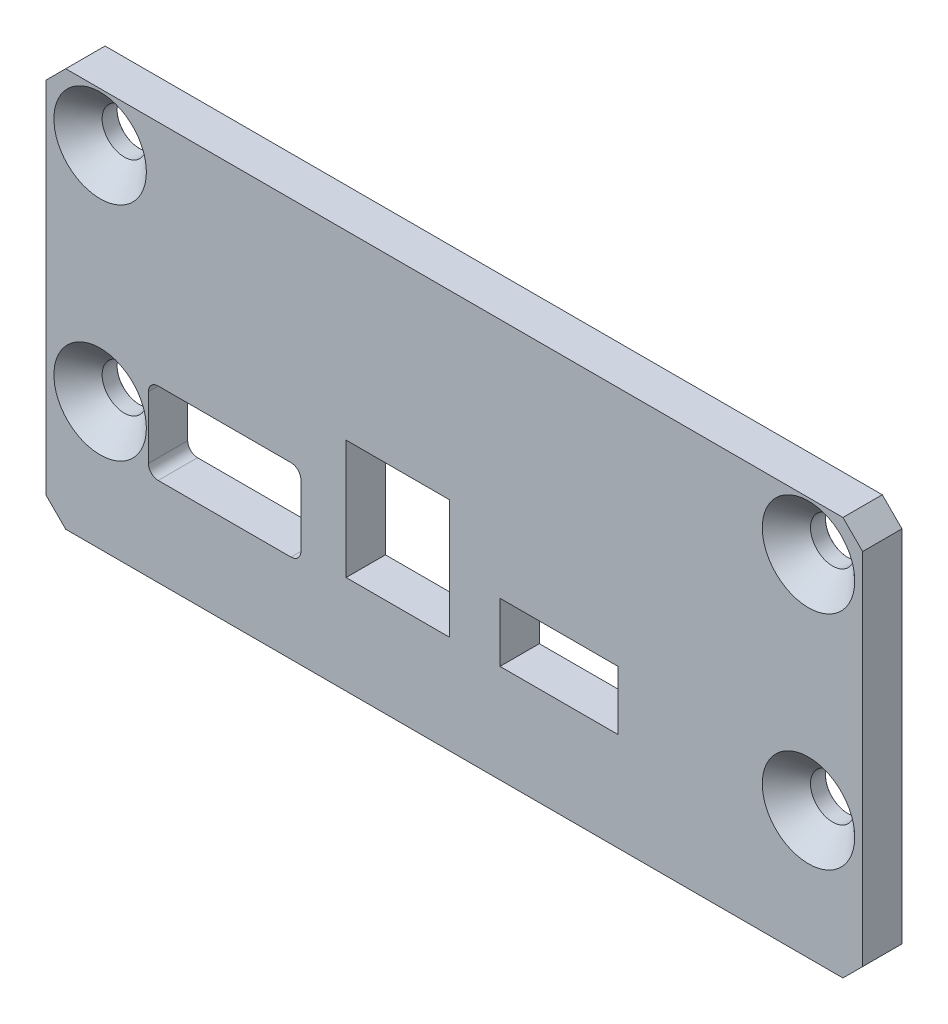
ISO-10303-21;
HEADER;
FILE_DESCRIPTION(('STEP AP214'),'2;1');
FILE_NAME('part.step','',(''),(''),'','','');
FILE_SCHEMA(('AUTOMOTIVE_DESIGN { 1 0 10303 214 1 1 1 1 }'));
ENDSEC;
DATA;
#1=APPLICATION_CONTEXT('core data for automotive mechanical design processes');
#2=APPLICATION_PROTOCOL_DEFINITION('international standard','automotive_design',2000,#1);
#3=PRODUCT_CONTEXT('',#1,'mechanical');
#4=PRODUCT('Part','Part','',(#3));
#5=PRODUCT_RELATED_PRODUCT_CATEGORY('part','',(#4));
#6=PRODUCT_DEFINITION_FORMATION('','',#4);
#7=PRODUCT_DEFINITION_CONTEXT('part definition',#1,'design');
#8=PRODUCT_DEFINITION('design','',#6,#7);
#9=PRODUCT_DEFINITION_SHAPE('','',#8);
#10=(LENGTH_UNIT() NAMED_UNIT(*) SI_UNIT(.MILLI.,.METRE.));
#11=(NAMED_UNIT(*) PLANE_ANGLE_UNIT() SI_UNIT($,.RADIAN.));
#12=(NAMED_UNIT(*) SI_UNIT($,.STERADIAN.) SOLID_ANGLE_UNIT());
#13=UNCERTAINTY_MEASURE_WITH_UNIT(LENGTH_MEASURE(1.E-05),#10,'distance_accuracy_value','');
#14=(GEOMETRIC_REPRESENTATION_CONTEXT(3) GLOBAL_UNCERTAINTY_ASSIGNED_CONTEXT((#13)) GLOBAL_UNIT_ASSIGNED_CONTEXT((#10,
#11,#12)) REPRESENTATION_CONTEXT('',''));
#15=CARTESIAN_POINT('',(0.,0.,0.));
#16=DIRECTION('',(0.,0.,1.));
#17=DIRECTION('',(1.,0.,0.));
#18=AXIS2_PLACEMENT_3D('',#15,#16,#17);
#19=CARTESIAN_POINT('',(0.,0.,4.));
#20=DIRECTION('',(0.,0.,1.));
#21=DIRECTION('',(1.,0.,0.));
#22=AXIS2_PLACEMENT_3D('',#19,#20,#21);
#23=PLANE('',#22);
#24=CARTESIAN_POINT('',(-29.5564971751413,35.54,4.));
#25=DIRECTION('',(0.,0.,1.));
#26=DIRECTION('',(1.,0.,0.));
#27=AXIS2_PLACEMENT_3D('',#24,#25,#26);
#28=CIRCLE('',#27,4.7);
#29=CARTESIAN_POINT('',(-24.8564971751413,35.54,4.));
#30=VERTEX_POINT('',#29);
#31=EDGE_CURVE('E853',#30,#30,#28,.T.);
#32=ORIENTED_EDGE('',*,*,#31,.F.);
#33=EDGE_LOOP('',(#32));
#34=FACE_BOUND('',#33,.T.);
#35=CARTESIAN_POINT('',(-29.5564971751412,13.,4.));
#36=DIRECTION('',(0.,0.,1.));
#37=DIRECTION('',(1.,0.,0.));
#38=AXIS2_PLACEMENT_3D('',#35,#36,#37);
#39=CIRCLE('',#38,4.7);
#40=CARTESIAN_POINT('',(-24.8564971751413,13.,4.));
#41=VERTEX_POINT('',#40);
#42=EDGE_CURVE('E841',#41,#41,#39,.T.);
#43=ORIENTED_EDGE('',*,*,#42,.F.);
#44=EDGE_LOOP('',(#43));
#45=FACE_BOUND('',#44,.T.);
#46=CARTESIAN_POINT('',(42.4435028248588,13.,4.));
#47=DIRECTION('',(0.,0.,1.));
#48=DIRECTION('',(1.,0.,0.));
#49=AXIS2_PLACEMENT_3D('',#46,#47,#48);
#50=CIRCLE('',#49,4.7);
#51=CARTESIAN_POINT('',(47.1435028248588,13.,4.));
#52=VERTEX_POINT('',#51);
#53=EDGE_CURVE('E829',#52,#52,#50,.T.);
#54=ORIENTED_EDGE('',*,*,#53,.F.);
#55=EDGE_LOOP('',(#54));
#56=FACE_BOUND('',#55,.T.);
#57=CARTESIAN_POINT('',(42.4435028248588,35.54,4.));
#58=DIRECTION('',(0.,0.,1.));
#59=DIRECTION('',(1.,0.,0.));
#60=AXIS2_PLACEMENT_3D('',#57,#58,#59);
#61=CIRCLE('',#60,4.7);
#62=CARTESIAN_POINT('',(47.1435028248588,35.54,4.));
#63=VERTEX_POINT('',#62);
#64=EDGE_CURVE('E817',#63,#63,#61,.T.);
#65=ORIENTED_EDGE('',*,*,#64,.F.);
#66=EDGE_LOOP('',(#65));
#67=FACE_BOUND('',#66,.T.);
#68=DIRECTION('',(-0.70710678118655,-0.707106781186545,0.));
#69=VECTOR('',#68,1.);
#70=CARTESIAN_POINT('',(-33.0564971751413,40.54,4.));
#71=LINE('',#70,#69);
#72=CARTESIAN_POINT('',(-33.0564971751413,40.54,4.));
#73=VERTEX_POINT('',#72);
#74=CARTESIAN_POINT('',(-35.0564971751413,38.54,4.));
#75=VERTEX_POINT('',#74);
#76=EDGE_CURVE('E294',#73,#75,#71,.T.);
#77=ORIENTED_EDGE('',*,*,#76,.T.);
#78=DIRECTION('',(0.,-1.,0.));
#79=VECTOR('',#78,1.);
#80=CARTESIAN_POINT('',(-35.0564971751413,38.54,4.));
#81=LINE('',#80,#79);
#82=CARTESIAN_POINT('',(-35.0564971751413,2.,4.));
#83=VERTEX_POINT('',#82);
#84=EDGE_CURVE('E297',#75,#83,#81,.T.);
#85=ORIENTED_EDGE('',*,*,#84,.T.);
#86=DIRECTION('',(0.70710678118655,-0.707106781186545,0.));
#87=VECTOR('',#86,1.);
#88=CARTESIAN_POINT('',(-35.0564971751413,2.,4.));
#89=LINE('',#88,#87);
#90=CARTESIAN_POINT('',(-33.0564971751412,0.,4.));
#91=VERTEX_POINT('',#90);
#92=EDGE_CURVE('E300',#83,#91,#89,.T.);
#93=ORIENTED_EDGE('',*,*,#92,.T.);
#94=DIRECTION('',(1.,0.,0.));
#95=VECTOR('',#94,1.);
#96=CARTESIAN_POINT('',(-33.0564971751412,0.,4.));
#97=LINE('',#96,#95);
#98=CARTESIAN_POINT('',(45.9435028248587,0.,4.));
#99=VERTEX_POINT('',#98);
#100=EDGE_CURVE('E302',#91,#99,#97,.T.);
#101=ORIENTED_EDGE('',*,*,#100,.T.);
#102=DIRECTION('',(0.70710678118655,0.707106781186545,0.));
#103=VECTOR('',#102,1.);
#104=CARTESIAN_POINT('',(45.9435028248587,0.,4.));
#105=LINE('',#104,#103);
#106=CARTESIAN_POINT('',(47.9435028248587,2.,4.));
#107=VERTEX_POINT('',#106);
#108=EDGE_CURVE('E304',#99,#107,#105,.T.);
#109=ORIENTED_EDGE('',*,*,#108,.T.);
#110=DIRECTION('',(0.,1.,0.));
#111=VECTOR('',#110,1.);
#112=CARTESIAN_POINT('',(47.9435028248587,2.,4.));
#113=LINE('',#112,#111);
#114=CARTESIAN_POINT('',(47.9435028248587,38.54,4.));
#115=VERTEX_POINT('',#114);
#116=EDGE_CURVE('E306',#107,#115,#113,.T.);
#117=ORIENTED_EDGE('',*,*,#116,.T.);
#118=DIRECTION('',(-0.70710678118655,0.707106781186545,0.));
#119=VECTOR('',#118,1.);
#120=CARTESIAN_POINT('',(47.9435028248587,38.54,4.));
#121=LINE('',#120,#119);
#122=CARTESIAN_POINT('',(45.9435028248587,40.54,4.));
#123=VERTEX_POINT('',#122);
#124=EDGE_CURVE('E308',#115,#123,#121,.T.);
#125=ORIENTED_EDGE('',*,*,#124,.T.);
#126=DIRECTION('',(-1.,0.,0.));
#127=VECTOR('',#126,1.);
#128=CARTESIAN_POINT('',(45.9435028248587,40.54,4.));
#129=LINE('',#128,#127);
#130=EDGE_CURVE('E310',#123,#73,#129,.T.);
#131=ORIENTED_EDGE('',*,*,#130,.T.);
#132=EDGE_LOOP('',(#77,#85,#93,#101,#109,#117,#125,#131));
#133=FACE_BOUND('',#132,.T.);
#134=DIRECTION('',(1.,0.,0.));
#135=VECTOR('',#134,1.);
#136=CARTESIAN_POINT('',(-24.6564971751412,9.,4.));
#137=LINE('',#136,#135);
#138=CARTESIAN_POINT('',(-23.6564971751412,9.,4.));
#139=VERTEX_POINT('',#138);
#140=CARTESIAN_POINT('',(-10.1564971751412,9.,4.));
#141=VERTEX_POINT('',#140);
#142=EDGE_CURVE('E273',#139,#141,#137,.T.);
#143=ORIENTED_EDGE('',*,*,#142,.F.);
#144=CARTESIAN_POINT('',(-23.6564971751412,10.,4.));
#145=DIRECTION('',(0.,0.,1.));
#146=DIRECTION('',(1.,0.,0.));
#147=AXIS2_PLACEMENT_3D('',#144,#145,#146);
#148=CIRCLE('',#147,1.);
#149=CARTESIAN_POINT('',(-24.6564971751412,10.,4.));
#150=VERTEX_POINT('',#149);
#151=EDGE_CURVE('E49',#139,#150,#148,.F.);
#152=ORIENTED_EDGE('',*,*,#151,.T.);
#153=DIRECTION('',(0.,-1.,0.));
#154=VECTOR('',#153,1.);
#155=CARTESIAN_POINT('',(-24.6564971751412,17.3129631137116,4.));
#156=LINE('',#155,#154);
#157=CARTESIAN_POINT('',(-24.6564971751412,16.3129631137116,4.));
#158=VERTEX_POINT('',#157);
#159=EDGE_CURVE('E271',#158,#150,#156,.T.);
#160=ORIENTED_EDGE('',*,*,#159,.F.);
#161=CARTESIAN_POINT('',(-23.6564971751412,16.3129631137116,4.));
#162=DIRECTION('',(0.,0.,1.));
#163=DIRECTION('',(1.,0.,0.));
#164=AXIS2_PLACEMENT_3D('',#161,#162,#163);
#165=CIRCLE('',#164,1.);
#166=CARTESIAN_POINT('',(-23.6564971751412,17.3129631137116,4.));
#167=VERTEX_POINT('',#166);
#168=EDGE_CURVE('E11',#158,#167,#165,.F.);
#169=ORIENTED_EDGE('',*,*,#168,.T.);
#170=DIRECTION('',(-1.,0.,0.));
#171=VECTOR('',#170,1.);
#172=CARTESIAN_POINT('',(-24.6564971751412,17.3129631137116,4.));
#173=LINE('',#172,#171);
#174=CARTESIAN_POINT('',(-10.1564971751412,17.3129631137116,4.));
#175=VERTEX_POINT('',#174);
#176=EDGE_CURVE('E280',#175,#167,#173,.T.);
#177=ORIENTED_EDGE('',*,*,#176,.F.);
#178=CARTESIAN_POINT('',(-10.1564971751412,16.3129631137116,4.));
#179=DIRECTION('',(0.,0.,1.));
#180=DIRECTION('',(1.,0.,0.));
#181=AXIS2_PLACEMENT_3D('',#178,#179,#180);
#182=CIRCLE('',#181,1.);
#183=CARTESIAN_POINT('',(-9.15649717514124,16.3129631137116,4.));
#184=VERTEX_POINT('',#183);
#185=EDGE_CURVE('E372',#175,#184,#182,.F.);
#186=ORIENTED_EDGE('',*,*,#185,.T.);
#187=DIRECTION('',(0.,1.,0.));
#188=VECTOR('',#187,1.);
#189=CARTESIAN_POINT('',(-9.15649717514124,17.3129631137116,4.));
#190=LINE('',#189,#188);
#191=CARTESIAN_POINT('',(-9.15649717514124,10.,4.));
#192=VERTEX_POINT('',#191);
#193=EDGE_CURVE('E277',#192,#184,#190,.T.);
#194=ORIENTED_EDGE('',*,*,#193,.F.);
#195=CARTESIAN_POINT('',(-10.1564971751412,10.,4.));
#196=DIRECTION('',(0.,0.,1.));
#197=DIRECTION('',(1.,0.,0.));
#198=AXIS2_PLACEMENT_3D('',#195,#196,#197);
#199=CIRCLE('',#198,1.);
#200=EDGE_CURVE('E376',#192,#141,#199,.F.);
#201=ORIENTED_EDGE('',*,*,#200,.T.);
#202=EDGE_LOOP('',(#143,#152,#160,#169,#177,#186,#194,#201));
#203=FACE_BOUND('',#202,.T.);
#204=DIRECTION('',(0.,1.,0.));
#205=VECTOR('',#204,1.);
#206=CARTESIAN_POINT('',(5.94350282485875,10.,4.));
#207=LINE('',#206,#205);
#208=CARTESIAN_POINT('',(5.94350282485875,10.,4.));
#209=VERTEX_POINT('',#208);
#210=CARTESIAN_POINT('',(5.94350282485875,22.1,4.));
#211=VERTEX_POINT('',#210);
#212=EDGE_CURVE('E242',#209,#211,#207,.T.);
#213=ORIENTED_EDGE('',*,*,#212,.F.);
#214=DIRECTION('',(1.,0.,0.));
#215=VECTOR('',#214,1.);
#216=CARTESIAN_POINT('',(-4.55649717514125,10.,4.));
#217=LINE('',#216,#215);
#218=CARTESIAN_POINT('',(-4.55649717514125,10.,4.));
#219=VERTEX_POINT('',#218);
#220=EDGE_CURVE('E240',#219,#209,#217,.T.);
#221=ORIENTED_EDGE('',*,*,#220,.F.);
#222=DIRECTION('',(0.,-1.,0.));
#223=VECTOR('',#222,1.);
#224=CARTESIAN_POINT('',(-4.55649717514125,10.,4.));
#225=LINE('',#224,#223);
#226=CARTESIAN_POINT('',(-4.55649717514125,22.1,4.));
#227=VERTEX_POINT('',#226);
#228=EDGE_CURVE('E248',#227,#219,#225,.T.);
#229=ORIENTED_EDGE('',*,*,#228,.F.);
#230=DIRECTION('',(-1.,0.,0.));
#231=VECTOR('',#230,1.);
#232=CARTESIAN_POINT('',(-4.55649717514125,22.1,4.));
#233=LINE('',#232,#231);
#234=EDGE_CURVE('E245',#211,#227,#233,.T.);
#235=ORIENTED_EDGE('',*,*,#234,.F.);
#236=EDGE_LOOP('',(#213,#221,#229,#235));
#237=FACE_BOUND('',#236,.T.);
#238=DIRECTION('',(1.,0.,0.));
#239=VECTOR('',#238,1.);
#240=CARTESIAN_POINT('',(11.0863367960814,10.,4.));
#241=LINE('',#240,#239);
#242=CARTESIAN_POINT('',(11.0863367960814,10.,4.));
#243=VERTEX_POINT('',#242);
#244=CARTESIAN_POINT('',(23.0863367960814,10.,4.));
#245=VERTEX_POINT('',#244);
#246=EDGE_CURVE('E207',#243,#245,#241,.T.);
#247=ORIENTED_EDGE('',*,*,#246,.F.);
#248=DIRECTION('',(0.,-1.,0.));
#249=VECTOR('',#248,1.);
#250=CARTESIAN_POINT('',(11.0863367960814,16.,4.));
#251=LINE('',#250,#249);
#252=CARTESIAN_POINT('',(11.0863367960814,16.,4.));
#253=VERTEX_POINT('',#252);
#254=EDGE_CURVE('E197',#253,#243,#251,.T.);
#255=ORIENTED_EDGE('',*,*,#254,.F.);
#256=DIRECTION('',(-1.,0.,0.));
#257=VECTOR('',#256,1.);
#258=CARTESIAN_POINT('',(11.0863367960814,16.,4.));
#259=LINE('',#258,#257);
#260=CARTESIAN_POINT('',(23.0863367960814,16.,4.));
#261=VERTEX_POINT('',#260);
#262=EDGE_CURVE('E222',#261,#253,#259,.T.);
#263=ORIENTED_EDGE('',*,*,#262,.F.);
#264=DIRECTION('',(0.,1.,0.));
#265=VECTOR('',#264,1.);
#266=CARTESIAN_POINT('',(23.0863367960814,16.,4.));
#267=LINE('',#266,#265);
#268=EDGE_CURVE('E220',#245,#261,#267,.T.);
#269=ORIENTED_EDGE('',*,*,#268,.F.);
#270=EDGE_LOOP('',(#247,#255,#263,#269));
#271=FACE_BOUND('',#270,.T.);
#272=ADVANCED_FACE('F34',(#34,#45,#56,#67,#133,#203,#237,#271),#23,.T.);
#273=CARTESIAN_POINT('',(0.,0.,0.));
#274=DIRECTION('',(0.,0.,1.));
#275=DIRECTION('',(1.,0.,0.));
#276=AXIS2_PLACEMENT_3D('',#273,#274,#275);
#277=PLANE('',#276);
#278=CARTESIAN_POINT('',(-29.5564971751413,35.54,0.));
#279=DIRECTION('',(0.,0.,1.));
#280=DIRECTION('',(1.,0.,0.));
#281=AXIS2_PLACEMENT_3D('',#278,#279,#280);
#282=CIRCLE('',#281,2.275);
#283=CARTESIAN_POINT('',(-27.2814971751413,35.54,0.));
#284=VERTEX_POINT('',#283);
#285=EDGE_CURVE('E856',#284,#284,#282,.T.);
#286=ORIENTED_EDGE('',*,*,#285,.T.);
#287=EDGE_LOOP('',(#286));
#288=FACE_BOUND('',#287,.T.);
#289=CARTESIAN_POINT('',(-29.5564971751412,13.,0.));
#290=DIRECTION('',(0.,0.,1.));
#291=DIRECTION('',(1.,0.,0.));
#292=AXIS2_PLACEMENT_3D('',#289,#290,#291);
#293=CIRCLE('',#292,2.275);
#294=CARTESIAN_POINT('',(-27.2814971751413,13.,0.));
#295=VERTEX_POINT('',#294);
#296=EDGE_CURVE('E844',#295,#295,#293,.T.);
#297=ORIENTED_EDGE('',*,*,#296,.T.);
#298=EDGE_LOOP('',(#297));
#299=FACE_BOUND('',#298,.T.);
#300=CARTESIAN_POINT('',(42.4435028248588,13.,0.));
#301=DIRECTION('',(0.,0.,1.));
#302=DIRECTION('',(1.,0.,0.));
#303=AXIS2_PLACEMENT_3D('',#300,#301,#302);
#304=CIRCLE('',#303,2.275);
#305=CARTESIAN_POINT('',(44.7185028248588,13.,0.));
#306=VERTEX_POINT('',#305);
#307=EDGE_CURVE('E832',#306,#306,#304,.T.);
#308=ORIENTED_EDGE('',*,*,#307,.T.);
#309=EDGE_LOOP('',(#308));
#310=FACE_BOUND('',#309,.T.);
#311=CARTESIAN_POINT('',(42.4435028248588,35.54,0.));
#312=DIRECTION('',(0.,0.,1.));
#313=DIRECTION('',(1.,0.,0.));
#314=AXIS2_PLACEMENT_3D('',#311,#312,#313);
#315=CIRCLE('',#314,2.275);
#316=CARTESIAN_POINT('',(44.7185028248588,35.54,0.));
#317=VERTEX_POINT('',#316);
#318=EDGE_CURVE('E812',#317,#317,#315,.T.);
#319=ORIENTED_EDGE('',*,*,#318,.T.);
#320=EDGE_LOOP('',(#319));
#321=FACE_BOUND('',#320,.T.);
#322=DIRECTION('',(1.,0.,0.));
#323=VECTOR('',#322,1.);
#324=CARTESIAN_POINT('',(-4.55649717514125,10.,0.));
#325=LINE('',#324,#323);
#326=CARTESIAN_POINT('',(-4.55649717514125,10.,0.));
#327=VERTEX_POINT('',#326);
#328=CARTESIAN_POINT('',(5.94350282485875,10.,0.));
#329=VERTEX_POINT('',#328);
#330=EDGE_CURVE('E215',#327,#329,#325,.T.);
#331=ORIENTED_EDGE('',*,*,#330,.T.);
#332=DIRECTION('',(0.,1.,0.));
#333=VECTOR('',#332,1.);
#334=CARTESIAN_POINT('',(5.94350282485875,10.,0.));
#335=LINE('',#334,#333);
#336=CARTESIAN_POINT('',(5.94350282485875,22.1,0.));
#337=VERTEX_POINT('',#336);
#338=EDGE_CURVE('E253',#329,#337,#335,.T.);
#339=ORIENTED_EDGE('',*,*,#338,.T.);
#340=DIRECTION('',(-1.,0.,0.));
#341=VECTOR('',#340,1.);
#342=CARTESIAN_POINT('',(-4.55649717514125,22.1,0.));
#343=LINE('',#342,#341);
#344=CARTESIAN_POINT('',(-4.55649717514125,22.1,0.));
#345=VERTEX_POINT('',#344);
#346=EDGE_CURVE('E256',#337,#345,#343,.T.);
#347=ORIENTED_EDGE('',*,*,#346,.T.);
#348=DIRECTION('',(0.,-1.,0.));
#349=VECTOR('',#348,1.);
#350=CARTESIAN_POINT('',(-4.55649717514125,10.,0.));
#351=LINE('',#350,#349);
#352=EDGE_CURVE('E243',#345,#327,#351,.T.);
#353=ORIENTED_EDGE('',*,*,#352,.T.);
#354=EDGE_LOOP('',(#331,#339,#347,#353));
#355=FACE_BOUND('',#354,.T.);
#356=DIRECTION('',(-0.70710678118655,-0.707106781186545,0.));
#357=VECTOR('',#356,1.);
#358=CARTESIAN_POINT('',(-33.0564971751413,40.54,0.));
#359=LINE('',#358,#357);
#360=CARTESIAN_POINT('',(-33.0564971751413,40.54,0.));
#361=VERTEX_POINT('',#360);
#362=CARTESIAN_POINT('',(-35.0564971751413,38.54,0.));
#363=VERTEX_POINT('',#362);
#364=EDGE_CURVE('E283',#361,#363,#359,.T.);
#365=ORIENTED_EDGE('',*,*,#364,.F.);
#366=DIRECTION('',(-1.,0.,0.));
#367=VECTOR('',#366,1.);
#368=CARTESIAN_POINT('',(45.9435028248587,40.54,0.));
#369=LINE('',#368,#367);
#370=CARTESIAN_POINT('',(45.9435028248587,40.54,0.));
#371=VERTEX_POINT('',#370);
#372=EDGE_CURVE('E298',#371,#361,#369,.T.);
#373=ORIENTED_EDGE('',*,*,#372,.F.);
#374=DIRECTION('',(-0.70710678118655,0.707106781186545,0.));
#375=VECTOR('',#374,1.);
#376=CARTESIAN_POINT('',(47.9435028248587,38.54,0.));
#377=LINE('',#376,#375);
#378=CARTESIAN_POINT('',(47.9435028248587,38.54,0.));
#379=VERTEX_POINT('',#378);
#380=EDGE_CURVE('E325',#379,#371,#377,.T.);
#381=ORIENTED_EDGE('',*,*,#380,.F.);
#382=DIRECTION('',(0.,1.,0.));
#383=VECTOR('',#382,1.);
#384=CARTESIAN_POINT('',(47.9435028248587,2.,0.));
#385=LINE('',#384,#383);
#386=CARTESIAN_POINT('',(47.9435028248587,2.,0.));
#387=VERTEX_POINT('',#386);
#388=EDGE_CURVE('E323',#387,#379,#385,.T.);
#389=ORIENTED_EDGE('',*,*,#388,.F.);
#390=DIRECTION('',(0.70710678118655,0.707106781186545,0.));
#391=VECTOR('',#390,1.);
#392=CARTESIAN_POINT('',(45.9435028248587,0.,0.));
#393=LINE('',#392,#391);
#394=CARTESIAN_POINT('',(45.9435028248587,0.,0.));
#395=VERTEX_POINT('',#394);
#396=EDGE_CURVE('E321',#395,#387,#393,.T.);
#397=ORIENTED_EDGE('',*,*,#396,.F.);
#398=DIRECTION('',(1.,0.,0.));
#399=VECTOR('',#398,1.);
#400=CARTESIAN_POINT('',(-33.0564971751412,0.,0.));
#401=LINE('',#400,#399);
#402=CARTESIAN_POINT('',(-33.0564971751412,0.,0.));
#403=VERTEX_POINT('',#402);
#404=EDGE_CURVE('E319',#403,#395,#401,.T.);
#405=ORIENTED_EDGE('',*,*,#404,.F.);
#406=DIRECTION('',(0.70710678118655,-0.707106781186545,0.));
#407=VECTOR('',#406,1.);
#408=CARTESIAN_POINT('',(-35.0564971751413,2.,0.));
#409=LINE('',#408,#407);
#410=CARTESIAN_POINT('',(-35.0564971751413,2.,0.));
#411=VERTEX_POINT('',#410);
#412=EDGE_CURVE('E317',#411,#403,#409,.T.);
#413=ORIENTED_EDGE('',*,*,#412,.F.);
#414=DIRECTION('',(0.,-1.,0.));
#415=VECTOR('',#414,1.);
#416=CARTESIAN_POINT('',(-35.0564971751413,38.54,0.));
#417=LINE('',#416,#415);
#418=EDGE_CURVE('E315',#363,#411,#417,.T.);
#419=ORIENTED_EDGE('',*,*,#418,.F.);
#420=EDGE_LOOP('',(#365,#373,#381,#389,#397,#405,#413,#419));
#421=FACE_BOUND('',#420,.T.);
#422=DIRECTION('',(-1.,0.,0.));
#423=VECTOR('',#422,1.);
#424=CARTESIAN_POINT('',(-24.6564971751412,17.3129631137116,0.));
#425=LINE('',#424,#423);
#426=CARTESIAN_POINT('',(-10.1564971751412,17.3129631137116,0.));
#427=VERTEX_POINT('',#426);
#428=CARTESIAN_POINT('',(-23.6564971751412,17.3129631137116,0.));
#429=VERTEX_POINT('',#428);
#430=EDGE_CURVE('E274',#427,#429,#425,.T.);
#431=ORIENTED_EDGE('',*,*,#430,.T.);
#432=CARTESIAN_POINT('',(-23.6564971751412,16.3129631137116,0.));
#433=DIRECTION('',(0.,0.,1.));
#434=DIRECTION('',(1.,0.,0.));
#435=AXIS2_PLACEMENT_3D('',#432,#433,#434);
#436=CIRCLE('',#435,1.);
#437=CARTESIAN_POINT('',(-24.6564971751412,16.3129631137116,0.));
#438=VERTEX_POINT('',#437);
#439=EDGE_CURVE('E42',#429,#438,#436,.T.);
#440=ORIENTED_EDGE('',*,*,#439,.T.);
#441=DIRECTION('',(0.,-1.,0.));
#442=VECTOR('',#441,1.);
#443=CARTESIAN_POINT('',(-24.6564971751412,17.3129631137116,0.));
#444=LINE('',#443,#442);
#445=CARTESIAN_POINT('',(-24.6564971751412,10.,0.));
#446=VERTEX_POINT('',#445);
#447=EDGE_CURVE('E270',#438,#446,#444,.T.);
#448=ORIENTED_EDGE('',*,*,#447,.T.);
#449=CARTESIAN_POINT('',(-23.6564971751412,10.,0.));
#450=DIRECTION('',(0.,0.,1.));
#451=DIRECTION('',(1.,0.,0.));
#452=AXIS2_PLACEMENT_3D('',#449,#450,#451);
#453=CIRCLE('',#452,1.);
#454=CARTESIAN_POINT('',(-23.6564971751412,9.,0.));
#455=VERTEX_POINT('',#454);
#456=EDGE_CURVE('E378',#446,#455,#453,.T.);
#457=ORIENTED_EDGE('',*,*,#456,.T.);
#458=DIRECTION('',(1.,0.,0.));
#459=VECTOR('',#458,1.);
#460=CARTESIAN_POINT('',(-24.6564971751412,9.,0.));
#461=LINE('',#460,#459);
#462=CARTESIAN_POINT('',(-10.1564971751412,9.,0.));
#463=VERTEX_POINT('',#462);
#464=EDGE_CURVE('E286',#455,#463,#461,.T.);
#465=ORIENTED_EDGE('',*,*,#464,.T.);
#466=CARTESIAN_POINT('',(-10.1564971751412,10.,0.));
#467=DIRECTION('',(0.,0.,1.));
#468=DIRECTION('',(1.,0.,0.));
#469=AXIS2_PLACEMENT_3D('',#466,#467,#468);
#470=CIRCLE('',#469,1.);
#471=CARTESIAN_POINT('',(-9.15649717514124,10.,0.));
#472=VERTEX_POINT('',#471);
#473=EDGE_CURVE('E374',#463,#472,#470,.T.);
#474=ORIENTED_EDGE('',*,*,#473,.T.);
#475=DIRECTION('',(0.,1.,0.));
#476=VECTOR('',#475,1.);
#477=CARTESIAN_POINT('',(-9.15649717514124,17.3129631137116,0.));
#478=LINE('',#477,#476);
#479=CARTESIAN_POINT('',(-9.15649717514124,16.3129631137116,0.));
#480=VERTEX_POINT('',#479);
#481=EDGE_CURVE('E289',#472,#480,#478,.T.);
#482=ORIENTED_EDGE('',*,*,#481,.T.);
#483=CARTESIAN_POINT('',(-10.1564971751412,16.3129631137116,0.));
#484=DIRECTION('',(0.,0.,1.));
#485=DIRECTION('',(1.,0.,0.));
#486=AXIS2_PLACEMENT_3D('',#483,#484,#485);
#487=CIRCLE('',#486,1.);
#488=EDGE_CURVE('E370',#480,#427,#487,.T.);
#489=ORIENTED_EDGE('',*,*,#488,.T.);
#490=EDGE_LOOP('',(#431,#440,#448,#457,#465,#474,#482,#489));
#491=FACE_BOUND('',#490,.T.);
#492=DIRECTION('',(0.,-1.,0.));
#493=VECTOR('',#492,1.);
#494=CARTESIAN_POINT('',(11.0863367960814,16.,0.));
#495=LINE('',#494,#493);
#496=CARTESIAN_POINT('',(11.0863367960814,16.,0.));
#497=VERTEX_POINT('',#496);
#498=CARTESIAN_POINT('',(11.0863367960814,10.,0.));
#499=VERTEX_POINT('',#498);
#500=EDGE_CURVE('E227',#497,#499,#495,.T.);
#501=ORIENTED_EDGE('',*,*,#500,.T.);
#502=DIRECTION('',(1.,0.,0.));
#503=VECTOR('',#502,1.);
#504=CARTESIAN_POINT('',(11.0863367960814,10.,0.));
#505=LINE('',#504,#503);
#506=CARTESIAN_POINT('',(23.0863367960814,10.,0.));
#507=VERTEX_POINT('',#506);
#508=EDGE_CURVE('E214',#499,#507,#505,.T.);
#509=ORIENTED_EDGE('',*,*,#508,.T.);
#510=DIRECTION('',(0.,1.,0.));
#511=VECTOR('',#510,1.);
#512=CARTESIAN_POINT('',(23.0863367960814,16.,0.));
#513=LINE('',#512,#511);
#514=CARTESIAN_POINT('',(23.0863367960814,16.,0.));
#515=VERTEX_POINT('',#514);
#516=EDGE_CURVE('E231',#507,#515,#513,.T.);
#517=ORIENTED_EDGE('',*,*,#516,.T.);
#518=DIRECTION('',(-1.,0.,0.));
#519=VECTOR('',#518,1.);
#520=CARTESIAN_POINT('',(11.0863367960814,16.,0.));
#521=LINE('',#520,#519);
#522=EDGE_CURVE('E208',#515,#497,#521,.T.);
#523=ORIENTED_EDGE('',*,*,#522,.T.);
#524=EDGE_LOOP('',(#501,#509,#517,#523));
#525=FACE_BOUND('',#524,.T.);
#526=ADVANCED_FACE('F381',(#288,#299,#310,#321,#355,#421,#491,#525),#277,.F.);
#527=CARTESIAN_POINT('',(-33.0564971751413,40.54,4.));
#528=DIRECTION('',(0.707106781186545,-0.70710678118655,0.));
#529=DIRECTION('',(0.70710678118655,0.707106781186545,0.));
#530=AXIS2_PLACEMENT_3D('',#527,#528,#529);
#531=PLANE('',#530);
#532=ORIENTED_EDGE('',*,*,#364,.T.);
#533=DIRECTION('',(0.,0.,-1.));
#534=VECTOR('',#533,1.);
#535=CARTESIAN_POINT('',(-35.0564971751413,38.54,4.));
#536=LINE('',#535,#534);
#537=EDGE_CURVE('E348',#75,#363,#536,.T.);
#538=ORIENTED_EDGE('',*,*,#537,.F.);
#539=ORIENTED_EDGE('',*,*,#76,.F.);
#540=DIRECTION('',(0.,0.,-1.));
#541=VECTOR('',#540,1.);
#542=CARTESIAN_POINT('',(-33.0564971751413,40.54,4.));
#543=LINE('',#542,#541);
#544=EDGE_CURVE('E312',#73,#361,#543,.T.);
#545=ORIENTED_EDGE('',*,*,#544,.T.);
#546=EDGE_LOOP('',(#532,#538,#539,#545));
#547=FACE_BOUND('',#546,.T.);
#548=ADVANCED_FACE('F425',(#547),#531,.F.);
#549=CARTESIAN_POINT('',(-35.0564971751413,38.54,4.));
#550=DIRECTION('',(1.,0.,0.));
#551=DIRECTION('',(0.,0.,-1.));
#552=AXIS2_PLACEMENT_3D('',#549,#550,#551);
#553=PLANE('',#552);
#554=ORIENTED_EDGE('',*,*,#418,.T.);
#555=DIRECTION('',(0.,0.,-1.));
#556=VECTOR('',#555,1.);
#557=CARTESIAN_POINT('',(-35.0564971751413,2.,4.));
#558=LINE('',#557,#556);
#559=EDGE_CURVE('E345',#83,#411,#558,.T.);
#560=ORIENTED_EDGE('',*,*,#559,.F.);
#561=ORIENTED_EDGE('',*,*,#84,.F.);
#562=ORIENTED_EDGE('',*,*,#537,.T.);
#563=EDGE_LOOP('',(#554,#560,#561,#562));
#564=FACE_BOUND('',#563,.T.);
#565=ADVANCED_FACE('F456',(#564),#553,.F.);
#566=CARTESIAN_POINT('',(-35.0564971751413,2.,4.));
#567=DIRECTION('',(0.707106781186545,0.70710678118655,0.));
#568=DIRECTION('',(-0.70710678118655,0.707106781186545,0.));
#569=AXIS2_PLACEMENT_3D('',#566,#567,#568);
#570=PLANE('',#569);
#571=ORIENTED_EDGE('',*,*,#412,.T.);
#572=DIRECTION('',(0.,0.,-1.));
#573=VECTOR('',#572,1.);
#574=CARTESIAN_POINT('',(-33.0564971751412,0.,4.));
#575=LINE('',#574,#573);
#576=EDGE_CURVE('E342',#91,#403,#575,.T.);
#577=ORIENTED_EDGE('',*,*,#576,.F.);
#578=ORIENTED_EDGE('',*,*,#92,.F.);
#579=ORIENTED_EDGE('',*,*,#559,.T.);
#580=EDGE_LOOP('',(#571,#577,#578,#579));
#581=FACE_BOUND('',#580,.T.);
#582=ADVANCED_FACE('F452',(#581),#570,.F.);
#583=CARTESIAN_POINT('',(-33.0564971751412,0.,4.));
#584=DIRECTION('',(0.,1.,0.));
#585=DIRECTION('',(0.,0.,1.));
#586=AXIS2_PLACEMENT_3D('',#583,#584,#585);
#587=PLANE('',#586);
#588=ORIENTED_EDGE('',*,*,#404,.T.);
#589=DIRECTION('',(0.,0.,-1.));
#590=VECTOR('',#589,1.);
#591=CARTESIAN_POINT('',(45.9435028248587,0.,4.));
#592=LINE('',#591,#590);
#593=EDGE_CURVE('E339',#99,#395,#592,.T.);
#594=ORIENTED_EDGE('',*,*,#593,.F.);
#595=ORIENTED_EDGE('',*,*,#100,.F.);
#596=ORIENTED_EDGE('',*,*,#576,.T.);
#597=EDGE_LOOP('',(#588,#594,#595,#596));
#598=FACE_BOUND('',#597,.T.);
#599=ADVANCED_FACE('F448',(#598),#587,.F.);
#600=CARTESIAN_POINT('',(45.9435028248587,0.,4.));
#601=DIRECTION('',(-0.707106781186545,0.70710678118655,0.));
#602=DIRECTION('',(-0.70710678118655,-0.707106781186545,0.));
#603=AXIS2_PLACEMENT_3D('',#600,#601,#602);
#604=PLANE('',#603);
#605=ORIENTED_EDGE('',*,*,#396,.T.);
#606=DIRECTION('',(0.,0.,-1.));
#607=VECTOR('',#606,1.);
#608=CARTESIAN_POINT('',(47.9435028248587,2.,4.));
#609=LINE('',#608,#607);
#610=EDGE_CURVE('E336',#107,#387,#609,.T.);
#611=ORIENTED_EDGE('',*,*,#610,.F.);
#612=ORIENTED_EDGE('',*,*,#108,.F.);
#613=ORIENTED_EDGE('',*,*,#593,.T.);
#614=EDGE_LOOP('',(#605,#611,#612,#613));
#615=FACE_BOUND('',#614,.T.);
#616=ADVANCED_FACE('F444',(#615),#604,.F.);
#617=CARTESIAN_POINT('',(47.9435028248587,2.,4.));
#618=DIRECTION('',(-1.,0.,0.));
#619=DIRECTION('',(0.,0.,1.));
#620=AXIS2_PLACEMENT_3D('',#617,#618,#619);
#621=PLANE('',#620);
#622=ORIENTED_EDGE('',*,*,#388,.T.);
#623=DIRECTION('',(0.,0.,-1.));
#624=VECTOR('',#623,1.);
#625=CARTESIAN_POINT('',(47.9435028248587,38.54,4.));
#626=LINE('',#625,#624);
#627=EDGE_CURVE('E333',#115,#379,#626,.T.);
#628=ORIENTED_EDGE('',*,*,#627,.F.);
#629=ORIENTED_EDGE('',*,*,#116,.F.);
#630=ORIENTED_EDGE('',*,*,#610,.T.);
#631=EDGE_LOOP('',(#622,#628,#629,#630));
#632=FACE_BOUND('',#631,.T.);
#633=ADVANCED_FACE('F440',(#632),#621,.F.);
#634=CARTESIAN_POINT('',(47.9435028248587,38.54,4.));
#635=DIRECTION('',(-0.707106781186545,-0.70710678118655,0.));
#636=DIRECTION('',(0.70710678118655,-0.707106781186545,0.));
#637=AXIS2_PLACEMENT_3D('',#634,#635,#636);
#638=PLANE('',#637);
#639=ORIENTED_EDGE('',*,*,#380,.T.);
#640=DIRECTION('',(0.,0.,-1.));
#641=VECTOR('',#640,1.);
#642=CARTESIAN_POINT('',(45.9435028248587,40.54,4.));
#643=LINE('',#642,#641);
#644=EDGE_CURVE('E330',#123,#371,#643,.T.);
#645=ORIENTED_EDGE('',*,*,#644,.F.);
#646=ORIENTED_EDGE('',*,*,#124,.F.);
#647=ORIENTED_EDGE('',*,*,#627,.T.);
#648=EDGE_LOOP('',(#639,#645,#646,#647));
#649=FACE_BOUND('',#648,.T.);
#650=ADVANCED_FACE('F436',(#649),#638,.F.);
#651=CARTESIAN_POINT('',(45.9435028248587,40.54,4.));
#652=DIRECTION('',(0.,-1.,0.));
#653=DIRECTION('',(0.,0.,-1.));
#654=AXIS2_PLACEMENT_3D('',#651,#652,#653);
#655=PLANE('',#654);
#656=ORIENTED_EDGE('',*,*,#372,.T.);
#657=ORIENTED_EDGE('',*,*,#544,.F.);
#658=ORIENTED_EDGE('',*,*,#130,.F.);
#659=ORIENTED_EDGE('',*,*,#644,.T.);
#660=EDGE_LOOP('',(#656,#657,#658,#659));
#661=FACE_BOUND('',#660,.T.);
#662=ADVANCED_FACE('F433',(#661),#655,.F.);
#663=CARTESIAN_POINT('',(-24.6564971751412,17.3129631137116,4.));
#664=DIRECTION('',(1.,0.,0.));
#665=DIRECTION('',(0.,0.,-1.));
#666=AXIS2_PLACEMENT_3D('',#663,#664,#665);
#667=PLANE('',#666);
#668=ORIENTED_EDGE('',*,*,#159,.T.);
#669=DIRECTION('',(0.,0.,-1.));
#670=VECTOR('',#669,1.);
#671=CARTESIAN_POINT('',(-24.6564971751412,10.,0.));
#672=LINE('',#671,#670);
#673=EDGE_CURVE('E367',#150,#446,#672,.T.);
#674=ORIENTED_EDGE('',*,*,#673,.T.);
#675=ORIENTED_EDGE('',*,*,#447,.F.);
#676=DIRECTION('',(0.,0.,-1.));
#677=VECTOR('',#676,1.);
#678=CARTESIAN_POINT('',(-24.6564971751412,16.3129631137116,4.));
#679=LINE('',#678,#677);
#680=EDGE_CURVE('E56',#438,#158,#679,.F.);
#681=ORIENTED_EDGE('',*,*,#680,.T.);
#682=EDGE_LOOP('',(#668,#674,#675,#681));
#683=FACE_BOUND('',#682,.T.);
#684=ADVANCED_FACE('F386',(#683),#667,.T.);
#685=CARTESIAN_POINT('',(-24.6564971751412,9.,4.));
#686=DIRECTION('',(0.,1.,0.));
#687=DIRECTION('',(0.,0.,1.));
#688=AXIS2_PLACEMENT_3D('',#685,#686,#687);
#689=PLANE('',#688);
#690=ORIENTED_EDGE('',*,*,#142,.T.);
#691=DIRECTION('',(0.,0.,-1.));
#692=VECTOR('',#691,1.);
#693=CARTESIAN_POINT('',(-10.1564971751412,9.,0.));
#694=LINE('',#693,#692);
#695=EDGE_CURVE('E363',#141,#463,#694,.T.);
#696=ORIENTED_EDGE('',*,*,#695,.T.);
#697=ORIENTED_EDGE('',*,*,#464,.F.);
#698=DIRECTION('',(0.,0.,-1.));
#699=VECTOR('',#698,1.);
#700=CARTESIAN_POINT('',(-23.6564971751412,9.,4.));
#701=LINE('',#700,#699);
#702=EDGE_CURVE('E361',#455,#139,#701,.F.);
#703=ORIENTED_EDGE('',*,*,#702,.T.);
#704=EDGE_LOOP('',(#690,#696,#697,#703));
#705=FACE_BOUND('',#704,.T.);
#706=ADVANCED_FACE('F408',(#705),#689,.T.);
#707=CARTESIAN_POINT('',(-9.15649717514124,17.3129631137116,4.));
#708=DIRECTION('',(-1.,0.,0.));
#709=DIRECTION('',(0.,0.,1.));
#710=AXIS2_PLACEMENT_3D('',#707,#708,#709);
#711=PLANE('',#710);
#712=ORIENTED_EDGE('',*,*,#193,.T.);
#713=DIRECTION('',(0.,0.,-1.));
#714=VECTOR('',#713,1.);
#715=CARTESIAN_POINT('',(-9.15649717514124,16.3129631137116,0.));
#716=LINE('',#715,#714);
#717=EDGE_CURVE('E353',#184,#480,#716,.T.);
#718=ORIENTED_EDGE('',*,*,#717,.T.);
#719=ORIENTED_EDGE('',*,*,#481,.F.);
#720=DIRECTION('',(0.,0.,-1.));
#721=VECTOR('',#720,1.);
#722=CARTESIAN_POINT('',(-9.15649717514124,10.,4.));
#723=LINE('',#722,#721);
#724=EDGE_CURVE('E351',#472,#192,#723,.F.);
#725=ORIENTED_EDGE('',*,*,#724,.T.);
#726=EDGE_LOOP('',(#712,#718,#719,#725));
#727=FACE_BOUND('',#726,.T.);
#728=ADVANCED_FACE('F401',(#727),#711,.T.);
#729=CARTESIAN_POINT('',(-24.6564971751412,17.3129631137116,4.));
#730=DIRECTION('',(0.,-1.,0.));
#731=DIRECTION('',(0.,0.,-1.));
#732=AXIS2_PLACEMENT_3D('',#729,#730,#731);
#733=PLANE('',#732);
#734=ORIENTED_EDGE('',*,*,#430,.F.);
#735=DIRECTION('',(0.,0.,-1.));
#736=VECTOR('',#735,1.);
#737=CARTESIAN_POINT('',(-10.1564971751412,17.3129631137116,4.));
#738=LINE('',#737,#736);
#739=EDGE_CURVE('E359',#427,#175,#738,.F.);
#740=ORIENTED_EDGE('',*,*,#739,.T.);
#741=ORIENTED_EDGE('',*,*,#176,.T.);
#742=DIRECTION('',(0.,0.,-1.));
#743=VECTOR('',#742,1.);
#744=CARTESIAN_POINT('',(-23.6564971751412,17.3129631137116,0.));
#745=LINE('',#744,#743);
#746=EDGE_CURVE('E356',#167,#429,#745,.T.);
#747=ORIENTED_EDGE('',*,*,#746,.T.);
#748=EDGE_LOOP('',(#734,#740,#741,#747));
#749=FACE_BOUND('',#748,.T.);
#750=ADVANCED_FACE('F393',(#749),#733,.T.);
#751=CARTESIAN_POINT('',(-4.55649717514125,10.,4.));
#752=DIRECTION('',(0.,1.,0.));
#753=DIRECTION('',(0.,0.,1.));
#754=AXIS2_PLACEMENT_3D('',#751,#752,#753);
#755=PLANE('',#754);
#756=ORIENTED_EDGE('',*,*,#330,.F.);
#757=DIRECTION('',(0.,0.,-1.));
#758=VECTOR('',#757,1.);
#759=CARTESIAN_POINT('',(-4.55649717514125,10.,4.));
#760=LINE('',#759,#758);
#761=EDGE_CURVE('E250',#219,#327,#760,.T.);
#762=ORIENTED_EDGE('',*,*,#761,.F.);
#763=ORIENTED_EDGE('',*,*,#220,.T.);
#764=DIRECTION('',(0.,0.,-1.));
#765=VECTOR('',#764,1.);
#766=CARTESIAN_POINT('',(5.94350282485875,10.,4.));
#767=LINE('',#766,#765);
#768=EDGE_CURVE('E267',#209,#329,#767,.T.);
#769=ORIENTED_EDGE('',*,*,#768,.T.);
#770=EDGE_LOOP('',(#756,#762,#763,#769));
#771=FACE_BOUND('',#770,.T.);
#772=ADVANCED_FACE('F543',(#771),#755,.T.);
#773=CARTESIAN_POINT('',(5.94350282485875,10.,4.));
#774=DIRECTION('',(-1.,0.,0.));
#775=DIRECTION('',(0.,0.,1.));
#776=AXIS2_PLACEMENT_3D('',#773,#774,#775);
#777=PLANE('',#776);
#778=ORIENTED_EDGE('',*,*,#338,.F.);
#779=ORIENTED_EDGE('',*,*,#768,.F.);
#780=ORIENTED_EDGE('',*,*,#212,.T.);
#781=DIRECTION('',(0.,0.,-1.));
#782=VECTOR('',#781,1.);
#783=CARTESIAN_POINT('',(5.94350282485875,22.1,4.));
#784=LINE('',#783,#782);
#785=EDGE_CURVE('E265',#211,#337,#784,.T.);
#786=ORIENTED_EDGE('',*,*,#785,.T.);
#787=EDGE_LOOP('',(#778,#779,#780,#786));
#788=FACE_BOUND('',#787,.T.);
#789=ADVANCED_FACE('F539',(#788),#777,.T.);
#790=CARTESIAN_POINT('',(-4.55649717514125,22.1,4.));
#791=DIRECTION('',(0.,-1.,0.));
#792=DIRECTION('',(0.,0.,-1.));
#793=AXIS2_PLACEMENT_3D('',#790,#791,#792);
#794=PLANE('',#793);
#795=ORIENTED_EDGE('',*,*,#346,.F.);
#796=ORIENTED_EDGE('',*,*,#785,.F.);
#797=ORIENTED_EDGE('',*,*,#234,.T.);
#798=DIRECTION('',(0.,0.,-1.));
#799=VECTOR('',#798,1.);
#800=CARTESIAN_POINT('',(-4.55649717514125,22.1,4.));
#801=LINE('',#800,#799);
#802=EDGE_CURVE('E263',#227,#345,#801,.T.);
#803=ORIENTED_EDGE('',*,*,#802,.T.);
#804=EDGE_LOOP('',(#795,#796,#797,#803));
#805=FACE_BOUND('',#804,.T.);
#806=ADVANCED_FACE('F535',(#805),#794,.T.);
#807=CARTESIAN_POINT('',(-4.55649717514125,10.,4.));
#808=DIRECTION('',(1.,0.,0.));
#809=DIRECTION('',(0.,0.,-1.));
#810=AXIS2_PLACEMENT_3D('',#807,#808,#809);
#811=PLANE('',#810);
#812=ORIENTED_EDGE('',*,*,#352,.F.);
#813=ORIENTED_EDGE('',*,*,#802,.F.);
#814=ORIENTED_EDGE('',*,*,#228,.T.);
#815=ORIENTED_EDGE('',*,*,#761,.T.);
#816=EDGE_LOOP('',(#812,#813,#814,#815));
#817=FACE_BOUND('',#816,.T.);
#818=ADVANCED_FACE('F532',(#817),#811,.T.);
#819=CARTESIAN_POINT('',(11.0863367960814,16.,4.));
#820=DIRECTION('',(1.,0.,0.));
#821=DIRECTION('',(0.,0.,-1.));
#822=AXIS2_PLACEMENT_3D('',#819,#820,#821);
#823=PLANE('',#822);
#824=ORIENTED_EDGE('',*,*,#500,.F.);
#825=DIRECTION('',(0.,0.,-1.));
#826=VECTOR('',#825,1.);
#827=CARTESIAN_POINT('',(11.0863367960814,16.,4.));
#828=LINE('',#827,#826);
#829=EDGE_CURVE('E203',#253,#497,#828,.T.);
#830=ORIENTED_EDGE('',*,*,#829,.F.);
#831=ORIENTED_EDGE('',*,*,#254,.T.);
#832=DIRECTION('',(0.,0.,-1.));
#833=VECTOR('',#832,1.);
#834=CARTESIAN_POINT('',(11.0863367960814,10.,4.));
#835=LINE('',#834,#833);
#836=EDGE_CURVE('E200',#243,#499,#835,.T.);
#837=ORIENTED_EDGE('',*,*,#836,.T.);
#838=EDGE_LOOP('',(#824,#830,#831,#837));
#839=FACE_BOUND('',#838,.T.);
#840=ADVANCED_FACE('F199',(#839),#823,.T.);
#841=CARTESIAN_POINT('',(11.0863367960814,10.,4.));
#842=DIRECTION('',(0.,1.,0.));
#843=DIRECTION('',(0.,0.,1.));
#844=AXIS2_PLACEMENT_3D('',#841,#842,#843);
#845=PLANE('',#844);
#846=ORIENTED_EDGE('',*,*,#508,.F.);
#847=ORIENTED_EDGE('',*,*,#836,.F.);
#848=ORIENTED_EDGE('',*,*,#246,.T.);
#849=DIRECTION('',(0.,0.,-1.));
#850=VECTOR('',#849,1.);
#851=CARTESIAN_POINT('',(23.0863367960814,10.,4.));
#852=LINE('',#851,#850);
#853=EDGE_CURVE('E216',#245,#507,#852,.T.);
#854=ORIENTED_EDGE('',*,*,#853,.T.);
#855=EDGE_LOOP('',(#846,#847,#848,#854));
#856=FACE_BOUND('',#855,.T.);
#857=ADVANCED_FACE('F211',(#856),#845,.T.);
#858=CARTESIAN_POINT('',(23.0863367960814,16.,4.));
#859=DIRECTION('',(-1.,0.,0.));
#860=DIRECTION('',(0.,0.,1.));
#861=AXIS2_PLACEMENT_3D('',#858,#859,#860);
#862=PLANE('',#861);
#863=ORIENTED_EDGE('',*,*,#516,.F.);
#864=ORIENTED_EDGE('',*,*,#853,.F.);
#865=ORIENTED_EDGE('',*,*,#268,.T.);
#866=DIRECTION('',(0.,0.,-1.));
#867=VECTOR('',#866,1.);
#868=CARTESIAN_POINT('',(23.0863367960814,16.,4.));
#869=LINE('',#868,#867);
#870=EDGE_CURVE('E237',#261,#515,#869,.T.);
#871=ORIENTED_EDGE('',*,*,#870,.T.);
#872=EDGE_LOOP('',(#863,#864,#865,#871));
#873=FACE_BOUND('',#872,.T.);
#874=ADVANCED_FACE('F523',(#873),#862,.T.);
#875=CARTESIAN_POINT('',(11.0863367960814,16.,4.));
#876=DIRECTION('',(0.,-1.,0.));
#877=DIRECTION('',(0.,0.,-1.));
#878=AXIS2_PLACEMENT_3D('',#875,#876,#877);
#879=PLANE('',#878);
#880=ORIENTED_EDGE('',*,*,#522,.F.);
#881=ORIENTED_EDGE('',*,*,#870,.F.);
#882=ORIENTED_EDGE('',*,*,#262,.T.);
#883=ORIENTED_EDGE('',*,*,#829,.T.);
#884=EDGE_LOOP('',(#880,#881,#882,#883));
#885=FACE_BOUND('',#884,.T.);
#886=ADVANCED_FACE('F519',(#885),#879,.T.);
#887=CARTESIAN_POINT('',(42.4435028248588,35.54,0.0250000000000007));
#888=DIRECTION('',(0.,0.,-1.));
#889=DIRECTION('',(-1.,0.,0.));
#890=AXIS2_PLACEMENT_3D('',#887,#888,#889);
#891=CONICAL_SURFACE('',#890,2.25,0.785398163397396);
#892=ORIENTED_EDGE('',*,*,#318,.F.);
#893=EDGE_LOOP('',(#892));
#894=FACE_BOUND('',#893,.T.);
#895=CARTESIAN_POINT('',(42.4435028248588,35.54,0.0250000000000007));
#896=DIRECTION('',(0.,0.,1.));
#897=DIRECTION('',(1.,0.,0.));
#898=AXIS2_PLACEMENT_3D('',#895,#896,#897);
#899=CIRCLE('',#898,2.25);
#900=CARTESIAN_POINT('',(44.6935028248588,35.54,0.0250000000000007));
#901=VERTEX_POINT('',#900);
#902=EDGE_CURVE('E229',#901,#901,#899,.T.);
#903=ORIENTED_EDGE('',*,*,#902,.T.);
#904=EDGE_LOOP('',(#903));
#905=FACE_BOUND('',#904,.T.);
#906=ADVANCED_FACE('F515',(#894,#905),#891,.F.);
#907=CARTESIAN_POINT('',(42.4435028248588,35.54,4.));
#908=DIRECTION('',(0.,0.,1.));
#909=DIRECTION('',(1.,0.,0.));
#910=AXIS2_PLACEMENT_3D('',#907,#908,#909);
#911=CYLINDRICAL_SURFACE('',#910,2.25);
#912=ORIENTED_EDGE('',*,*,#902,.F.);
#913=EDGE_LOOP('',(#912));
#914=FACE_BOUND('',#913,.T.);
#915=CARTESIAN_POINT('',(42.4435028248588,35.54,1.55));
#916=DIRECTION('',(0.,0.,1.));
#917=DIRECTION('',(1.,0.,0.));
#918=AXIS2_PLACEMENT_3D('',#915,#916,#917);
#919=CIRCLE('',#918,2.25);
#920=CARTESIAN_POINT('',(44.6935028248588,35.54,1.55));
#921=VERTEX_POINT('',#920);
#922=EDGE_CURVE('E815',#921,#921,#919,.T.);
#923=ORIENTED_EDGE('',*,*,#922,.T.);
#924=EDGE_LOOP('',(#923));
#925=FACE_BOUND('',#924,.T.);
#926=ADVANCED_FACE('F511',(#914,#925),#911,.F.);
#927=CARTESIAN_POINT('',(42.4435028248588,35.54,4.));
#928=DIRECTION('',(0.,0.,1.));
#929=DIRECTION('',(1.,0.,0.));
#930=AXIS2_PLACEMENT_3D('',#927,#928,#929);
#931=CONICAL_SURFACE('',#930,4.7,0.785398163397449);
#932=ORIENTED_EDGE('',*,*,#922,.F.);
#933=EDGE_LOOP('',(#932));
#934=FACE_BOUND('',#933,.T.);
#935=ORIENTED_EDGE('',*,*,#64,.T.);
#936=EDGE_LOOP('',(#935));
#937=FACE_BOUND('',#936,.T.);
#938=ADVANCED_FACE('F507',(#934,#937),#931,.F.);
#939=CARTESIAN_POINT('',(42.4435028248588,13.,0.0250000000000007));
#940=DIRECTION('',(0.,0.,-1.));
#941=DIRECTION('',(-1.,0.,0.));
#942=AXIS2_PLACEMENT_3D('',#939,#940,#941);
#943=CONICAL_SURFACE('',#942,2.25,0.785398163397396);
#944=ORIENTED_EDGE('',*,*,#307,.F.);
#945=EDGE_LOOP('',(#944));
#946=FACE_BOUND('',#945,.T.);
#947=CARTESIAN_POINT('',(42.4435028248588,13.,0.0250000000000007));
#948=DIRECTION('',(0.,0.,1.));
#949=DIRECTION('',(1.,0.,0.));
#950=AXIS2_PLACEMENT_3D('',#947,#948,#949);
#951=CIRCLE('',#950,2.25);
#952=CARTESIAN_POINT('',(44.6935028248588,13.,0.0250000000000007));
#953=VERTEX_POINT('',#952);
#954=EDGE_CURVE('E823',#953,#953,#951,.T.);
#955=ORIENTED_EDGE('',*,*,#954,.T.);
#956=EDGE_LOOP('',(#955));
#957=FACE_BOUND('',#956,.T.);
#958=ADVANCED_FACE('F503',(#946,#957),#943,.F.);
#959=CARTESIAN_POINT('',(42.4435028248588,13.,4.));
#960=DIRECTION('',(0.,0.,1.));
#961=DIRECTION('',(1.,0.,0.));
#962=AXIS2_PLACEMENT_3D('',#959,#960,#961);
#963=CYLINDRICAL_SURFACE('',#962,2.25);
#964=ORIENTED_EDGE('',*,*,#954,.F.);
#965=EDGE_LOOP('',(#964));
#966=FACE_BOUND('',#965,.T.);
#967=CARTESIAN_POINT('',(42.4435028248588,13.,1.55));
#968=DIRECTION('',(0.,0.,1.));
#969=DIRECTION('',(1.,0.,0.));
#970=AXIS2_PLACEMENT_3D('',#967,#968,#969);
#971=CIRCLE('',#970,2.25);
#972=CARTESIAN_POINT('',(44.6935028248588,13.,1.55));
#973=VERTEX_POINT('',#972);
#974=EDGE_CURVE('E826',#973,#973,#971,.T.);
#975=ORIENTED_EDGE('',*,*,#974,.T.);
#976=EDGE_LOOP('',(#975));
#977=FACE_BOUND('',#976,.T.);
#978=ADVANCED_FACE('F499',(#966,#977),#963,.F.);
#979=CARTESIAN_POINT('',(42.4435028248588,13.,4.));
#980=DIRECTION('',(0.,0.,1.));
#981=DIRECTION('',(1.,0.,0.));
#982=AXIS2_PLACEMENT_3D('',#979,#980,#981);
#983=CONICAL_SURFACE('',#982,4.7,0.785398163397449);
#984=ORIENTED_EDGE('',*,*,#974,.F.);
#985=EDGE_LOOP('',(#984));
#986=FACE_BOUND('',#985,.T.);
#987=ORIENTED_EDGE('',*,*,#53,.T.);
#988=EDGE_LOOP('',(#987));
#989=FACE_BOUND('',#988,.T.);
#990=ADVANCED_FACE('F495',(#986,#989),#983,.F.);
#991=CARTESIAN_POINT('',(-29.5564971751412,13.,0.0250000000000007));
#992=DIRECTION('',(0.,0.,-1.));
#993=DIRECTION('',(-1.,0.,0.));
#994=AXIS2_PLACEMENT_3D('',#991,#992,#993);
#995=CONICAL_SURFACE('',#994,2.25,0.785398163397466);
#996=ORIENTED_EDGE('',*,*,#296,.F.);
#997=EDGE_LOOP('',(#996));
#998=FACE_BOUND('',#997,.T.);
#999=CARTESIAN_POINT('',(-29.5564971751412,13.,0.0250000000000007));
#1000=DIRECTION('',(0.,0.,1.));
#1001=DIRECTION('',(1.,0.,0.));
#1002=AXIS2_PLACEMENT_3D('',#999,#1000,#1001);
#1003=CIRCLE('',#1002,2.25);
#1004=CARTESIAN_POINT('',(-27.3064971751413,13.,0.0250000000000007));
#1005=VERTEX_POINT('',#1004);
#1006=EDGE_CURVE('E835',#1005,#1005,#1003,.T.);
#1007=ORIENTED_EDGE('',*,*,#1006,.T.);
#1008=EDGE_LOOP('',(#1007));
#1009=FACE_BOUND('',#1008,.T.);
#1010=ADVANCED_FACE('F491',(#998,#1009),#995,.F.);
#1011=CARTESIAN_POINT('',(-29.5564971751412,13.,4.));
#1012=DIRECTION('',(0.,0.,1.));
#1013=DIRECTION('',(1.,0.,0.));
#1014=AXIS2_PLACEMENT_3D('',#1011,#1012,#1013);
#1015=CYLINDRICAL_SURFACE('',#1014,2.25);
#1016=ORIENTED_EDGE('',*,*,#1006,.F.);
#1017=EDGE_LOOP('',(#1016));
#1018=FACE_BOUND('',#1017,.T.);
#1019=CARTESIAN_POINT('',(-29.5564971751412,13.,1.55));
#1020=DIRECTION('',(0.,0.,1.));
#1021=DIRECTION('',(1.,0.,0.));
#1022=AXIS2_PLACEMENT_3D('',#1019,#1020,#1021);
#1023=CIRCLE('',#1022,2.25);
#1024=CARTESIAN_POINT('',(-27.3064971751413,13.,1.55));
#1025=VERTEX_POINT('',#1024);
#1026=EDGE_CURVE('E838',#1025,#1025,#1023,.T.);
#1027=ORIENTED_EDGE('',*,*,#1026,.T.);
#1028=EDGE_LOOP('',(#1027));
#1029=FACE_BOUND('',#1028,.T.);
#1030=ADVANCED_FACE('F487',(#1018,#1029),#1015,.F.);
#1031=CARTESIAN_POINT('',(-29.5564971751412,13.,4.));
#1032=DIRECTION('',(0.,0.,1.));
#1033=DIRECTION('',(1.,0.,0.));
#1034=AXIS2_PLACEMENT_3D('',#1031,#1032,#1033);
#1035=CONICAL_SURFACE('',#1034,4.7,0.785398163397449);
#1036=ORIENTED_EDGE('',*,*,#1026,.F.);
#1037=EDGE_LOOP('',(#1036));
#1038=FACE_BOUND('',#1037,.T.);
#1039=ORIENTED_EDGE('',*,*,#42,.T.);
#1040=EDGE_LOOP('',(#1039));
#1041=FACE_BOUND('',#1040,.T.);
#1042=ADVANCED_FACE('F483',(#1038,#1041),#1035,.F.);
#1043=CARTESIAN_POINT('',(-29.5564971751413,35.54,0.0250000000000007));
#1044=DIRECTION('',(0.,0.,-1.));
#1045=DIRECTION('',(-1.,0.,0.));
#1046=AXIS2_PLACEMENT_3D('',#1043,#1044,#1045);
#1047=CONICAL_SURFACE('',#1046,2.25,0.785398163397466);
#1048=ORIENTED_EDGE('',*,*,#285,.F.);
#1049=EDGE_LOOP('',(#1048));
#1050=FACE_BOUND('',#1049,.T.);
#1051=CARTESIAN_POINT('',(-29.5564971751413,35.54,0.0250000000000007));
#1052=DIRECTION('',(0.,0.,1.));
#1053=DIRECTION('',(1.,0.,0.));
#1054=AXIS2_PLACEMENT_3D('',#1051,#1052,#1053);
#1055=CIRCLE('',#1054,2.25);
#1056=CARTESIAN_POINT('',(-27.3064971751413,35.54,0.0250000000000007));
#1057=VERTEX_POINT('',#1056);
#1058=EDGE_CURVE('E847',#1057,#1057,#1055,.T.);
#1059=ORIENTED_EDGE('',*,*,#1058,.T.);
#1060=EDGE_LOOP('',(#1059));
#1061=FACE_BOUND('',#1060,.T.);
#1062=ADVANCED_FACE('F475',(#1050,#1061),#1047,.F.);
#1063=CARTESIAN_POINT('',(-29.5564971751413,35.54,4.));
#1064=DIRECTION('',(0.,0.,1.));
#1065=DIRECTION('',(1.,0.,0.));
#1066=AXIS2_PLACEMENT_3D('',#1063,#1064,#1065);
#1067=CYLINDRICAL_SURFACE('',#1066,2.25);
#1068=ORIENTED_EDGE('',*,*,#1058,.F.);
#1069=EDGE_LOOP('',(#1068));
#1070=FACE_BOUND('',#1069,.T.);
#1071=CARTESIAN_POINT('',(-29.5564971751413,35.54,1.55));
#1072=DIRECTION('',(0.,0.,1.));
#1073=DIRECTION('',(1.,0.,0.));
#1074=AXIS2_PLACEMENT_3D('',#1071,#1072,#1073);
#1075=CIRCLE('',#1074,2.25);
#1076=CARTESIAN_POINT('',(-27.3064971751413,35.54,1.55));
#1077=VERTEX_POINT('',#1076);
#1078=EDGE_CURVE('E850',#1077,#1077,#1075,.T.);
#1079=ORIENTED_EDGE('',*,*,#1078,.T.);
#1080=EDGE_LOOP('',(#1079));
#1081=FACE_BOUND('',#1080,.T.);
#1082=ADVANCED_FACE('F469',(#1070,#1081),#1067,.F.);
#1083=CARTESIAN_POINT('',(-29.5564971751413,35.54,4.));
#1084=DIRECTION('',(0.,0.,1.));
#1085=DIRECTION('',(1.,0.,0.));
#1086=AXIS2_PLACEMENT_3D('',#1083,#1084,#1085);
#1087=CONICAL_SURFACE('',#1086,4.7,0.785398163397449);
#1088=ORIENTED_EDGE('',*,*,#1078,.F.);
#1089=EDGE_LOOP('',(#1088));
#1090=FACE_BOUND('',#1089,.T.);
#1091=ORIENTED_EDGE('',*,*,#31,.T.);
#1092=EDGE_LOOP('',(#1091));
#1093=FACE_BOUND('',#1092,.T.);
#1094=ADVANCED_FACE('F465',(#1090,#1093),#1087,.F.);
#1095=CARTESIAN_POINT('',(-10.1564971751412,16.3129631137116,4.));
#1096=DIRECTION('',(0.,0.,1.));
#1097=DIRECTION('',(1.,0.,0.));
#1098=AXIS2_PLACEMENT_3D('',#1095,#1096,#1097);
#1099=CYLINDRICAL_SURFACE('',#1098,1.);
#1100=ORIENTED_EDGE('',*,*,#185,.F.);
#1101=ORIENTED_EDGE('',*,*,#739,.F.);
#1102=ORIENTED_EDGE('',*,*,#488,.F.);
#1103=ORIENTED_EDGE('',*,*,#717,.F.);
#1104=EDGE_LOOP('',(#1100,#1101,#1102,#1103));
#1105=FACE_BOUND('',#1104,.T.);
#1106=ADVANCED_FACE('F396',(#1105),#1099,.F.);
#1107=CARTESIAN_POINT('',(-10.1564971751412,10.,4.));
#1108=DIRECTION('',(0.,0.,1.));
#1109=DIRECTION('',(1.,0.,0.));
#1110=AXIS2_PLACEMENT_3D('',#1107,#1108,#1109);
#1111=CYLINDRICAL_SURFACE('',#1110,1.);
#1112=ORIENTED_EDGE('',*,*,#200,.F.);
#1113=ORIENTED_EDGE('',*,*,#724,.F.);
#1114=ORIENTED_EDGE('',*,*,#473,.F.);
#1115=ORIENTED_EDGE('',*,*,#695,.F.);
#1116=EDGE_LOOP('',(#1112,#1113,#1114,#1115));
#1117=FACE_BOUND('',#1116,.T.);
#1118=ADVANCED_FACE('F405',(#1117),#1111,.F.);
#1119=CARTESIAN_POINT('',(-23.6564971751412,10.,4.));
#1120=DIRECTION('',(0.,0.,1.));
#1121=DIRECTION('',(1.,0.,0.));
#1122=AXIS2_PLACEMENT_3D('',#1119,#1120,#1121);
#1123=CYLINDRICAL_SURFACE('',#1122,1.);
#1124=ORIENTED_EDGE('',*,*,#151,.F.);
#1125=ORIENTED_EDGE('',*,*,#702,.F.);
#1126=ORIENTED_EDGE('',*,*,#456,.F.);
#1127=ORIENTED_EDGE('',*,*,#673,.F.);
#1128=EDGE_LOOP('',(#1124,#1125,#1126,#1127));
#1129=FACE_BOUND('',#1128,.T.);
#1130=ADVANCED_FACE('F412',(#1129),#1123,.F.);
#1131=CARTESIAN_POINT('',(-23.6564971751412,16.3129631137116,4.));
#1132=DIRECTION('',(0.,0.,1.));
#1133=DIRECTION('',(1.,0.,0.));
#1134=AXIS2_PLACEMENT_3D('',#1131,#1132,#1133);
#1135=CYLINDRICAL_SURFACE('',#1134,1.);
#1136=ORIENTED_EDGE('',*,*,#168,.F.);
#1137=ORIENTED_EDGE('',*,*,#680,.F.);
#1138=ORIENTED_EDGE('',*,*,#439,.F.);
#1139=ORIENTED_EDGE('',*,*,#746,.F.);
#1140=EDGE_LOOP('',(#1136,#1137,#1138,#1139));
#1141=FACE_BOUND('',#1140,.T.);
#1142=ADVANCED_FACE('F36',(#1141),#1135,.F.);
#1143=CLOSED_SHELL('',(#272,#526,#548,#565,#582,#599,#616,#633,#650,#662,#684,#706,#728,#750,
#772,#789,#806,#818,#840,#857,#874,#886,#906,#926,#938,#958,#978,#990,#1010,#1030,#1042,#1062,
#1082,#1094,#1106,#1118,#1130,#1142));
#1144=MANIFOLD_SOLID_BREP('B2',#1143);
#1145=ADVANCED_BREP_SHAPE_REPRESENTATION('',(#18,#1144),#14);
#1146=SHAPE_DEFINITION_REPRESENTATION(#9,#1145);
ENDSEC;
END-ISO-10303-21;
